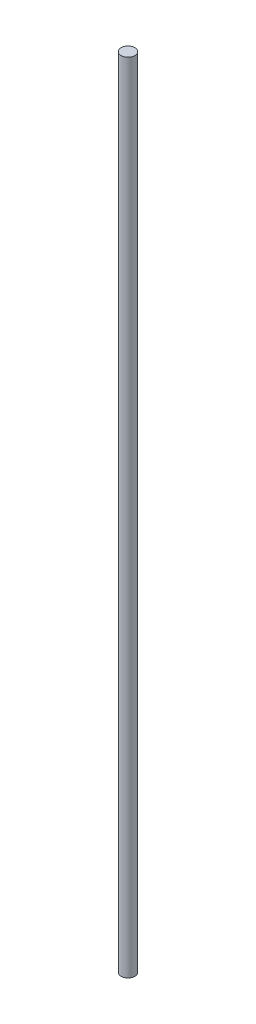
ISO-10303-21;
HEADER;
FILE_DESCRIPTION(('STEP AP214'),'2;1');
FILE_NAME('part.step','',(''),(''),'','','');
FILE_SCHEMA(('AUTOMOTIVE_DESIGN { 1 0 10303 214 1 1 1 1 }'));
ENDSEC;
DATA;
#1=APPLICATION_CONTEXT('core data for automotive mechanical design processes');
#2=APPLICATION_PROTOCOL_DEFINITION('international standard','automotive_design',2000,#1);
#3=PRODUCT_CONTEXT('',#1,'mechanical');
#4=PRODUCT('Part','Part','',(#3));
#5=PRODUCT_RELATED_PRODUCT_CATEGORY('part','',(#4));
#6=PRODUCT_DEFINITION_FORMATION('','',#4);
#7=PRODUCT_DEFINITION_CONTEXT('part definition',#1,'design');
#8=PRODUCT_DEFINITION('design','',#6,#7);
#9=PRODUCT_DEFINITION_SHAPE('','',#8);
#10=(LENGTH_UNIT() NAMED_UNIT(*) SI_UNIT(.MILLI.,.METRE.));
#11=(NAMED_UNIT(*) PLANE_ANGLE_UNIT() SI_UNIT($,.RADIAN.));
#12=(NAMED_UNIT(*) SI_UNIT($,.STERADIAN.) SOLID_ANGLE_UNIT());
#13=UNCERTAINTY_MEASURE_WITH_UNIT(LENGTH_MEASURE(1.E-05),#10,'distance_accuracy_value','');
#14=(GEOMETRIC_REPRESENTATION_CONTEXT(3) GLOBAL_UNCERTAINTY_ASSIGNED_CONTEXT((#13)) GLOBAL_UNIT_ASSIGNED_CONTEXT((#10,
#11,#12)) REPRESENTATION_CONTEXT('',''));
#15=CARTESIAN_POINT('',(0.,0.,0.));
#16=DIRECTION('',(0.,0.,1.));
#17=DIRECTION('',(1.,0.,0.));
#18=AXIS2_PLACEMENT_3D('',#15,#16,#17);
#19=CARTESIAN_POINT('',(0.,580.,0.));
#20=DIRECTION('',(0.,-1.,0.));
#21=DIRECTION('',(0.,0.,-1.));
#22=AXIS2_PLACEMENT_3D('',#19,#20,#21);
#23=CYLINDRICAL_SURFACE('',#22,5.);
#24=CARTESIAN_POINT('',(0.,580.,0.));
#25=DIRECTION('',(0.,1.,0.));
#26=DIRECTION('',(0.,0.,1.));
#27=AXIS2_PLACEMENT_3D('',#24,#25,#26);
#28=CIRCLE('',#27,5.);
#29=CARTESIAN_POINT('',(0.,580.,5.));
#30=VERTEX_POINT('',#29);
#31=EDGE_CURVE('E10',#30,#30,#28,.T.);
#32=ORIENTED_EDGE('',*,*,#31,.F.);
#33=EDGE_LOOP('',(#32));
#34=FACE_BOUND('',#33,.T.);
#35=CARTESIAN_POINT('',(0.,0.,0.));
#36=DIRECTION('',(0.,1.,0.));
#37=DIRECTION('',(0.,0.,1.));
#38=AXIS2_PLACEMENT_3D('',#35,#36,#37);
#39=CIRCLE('',#38,5.);
#40=CARTESIAN_POINT('',(0.,0.,5.));
#41=VERTEX_POINT('',#40);
#42=EDGE_CURVE('E34',#41,#41,#39,.T.);
#43=ORIENTED_EDGE('',*,*,#42,.T.);
#44=EDGE_LOOP('',(#43));
#45=FACE_BOUND('',#44,.T.);
#46=ADVANCED_FACE('F31',(#34,#45),#23,.T.);
#47=CARTESIAN_POINT('',(0.,580.,0.));
#48=DIRECTION('',(0.,1.,0.));
#49=DIRECTION('',(0.,0.,1.));
#50=AXIS2_PLACEMENT_3D('',#47,#48,#49);
#51=PLANE('',#50);
#52=ORIENTED_EDGE('',*,*,#31,.T.);
#53=EDGE_LOOP('',(#52));
#54=FACE_BOUND('',#53,.T.);
#55=ADVANCED_FACE('F46',(#54),#51,.T.);
#56=CARTESIAN_POINT('',(0.,0.,0.));
#57=DIRECTION('',(0.,1.,0.));
#58=DIRECTION('',(0.,0.,1.));
#59=AXIS2_PLACEMENT_3D('',#56,#57,#58);
#60=PLANE('',#59);
#61=ORIENTED_EDGE('',*,*,#42,.F.);
#62=EDGE_LOOP('',(#61));
#63=FACE_BOUND('',#62,.T.);
#64=ADVANCED_FACE('F44',(#63),#60,.F.);
#65=CLOSED_SHELL('',(#46,#55,#64));
#66=MANIFOLD_SOLID_BREP('B2',#65);
#67=ADVANCED_BREP_SHAPE_REPRESENTATION('',(#18,#66),#14);
#68=SHAPE_DEFINITION_REPRESENTATION(#9,#67);
ENDSEC;
END-ISO-10303-21;
